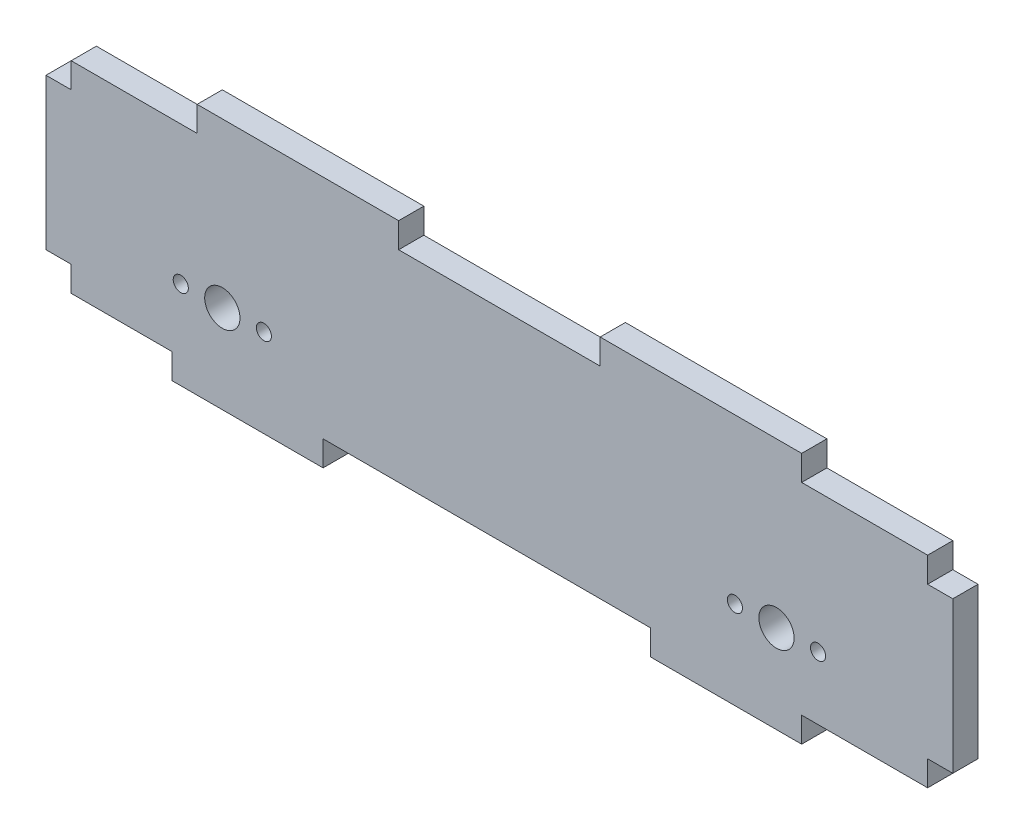
ISO-10303-21;
HEADER;
FILE_DESCRIPTION(('STEP AP214'),'2;1');
FILE_NAME('part.step','',(''),(''),'','','');
FILE_SCHEMA(('AUTOMOTIVE_DESIGN { 1 0 10303 214 1 1 1 1 }'));
ENDSEC;
DATA;
#1=APPLICATION_CONTEXT('core data for automotive mechanical design processes');
#2=APPLICATION_PROTOCOL_DEFINITION('international standard','automotive_design',2000,#1);
#3=PRODUCT_CONTEXT('',#1,'mechanical');
#4=PRODUCT('Part','Part','',(#3));
#5=PRODUCT_RELATED_PRODUCT_CATEGORY('part','',(#4));
#6=PRODUCT_DEFINITION_FORMATION('','',#4);
#7=PRODUCT_DEFINITION_CONTEXT('part definition',#1,'design');
#8=PRODUCT_DEFINITION('design','',#6,#7);
#9=PRODUCT_DEFINITION_SHAPE('','',#8);
#10=(LENGTH_UNIT() NAMED_UNIT(*) SI_UNIT(.MILLI.,.METRE.));
#11=(NAMED_UNIT(*) PLANE_ANGLE_UNIT() SI_UNIT($,.RADIAN.));
#12=(NAMED_UNIT(*) SI_UNIT($,.STERADIAN.) SOLID_ANGLE_UNIT());
#13=UNCERTAINTY_MEASURE_WITH_UNIT(LENGTH_MEASURE(1.E-05),#10,'distance_accuracy_value','');
#14=(GEOMETRIC_REPRESENTATION_CONTEXT(3) GLOBAL_UNCERTAINTY_ASSIGNED_CONTEXT((#13)) GLOBAL_UNIT_ASSIGNED_CONTEXT((#10,
#11,#12)) REPRESENTATION_CONTEXT('',''));
#15=CARTESIAN_POINT('',(0.,0.,0.));
#16=DIRECTION('',(0.,0.,1.));
#17=DIRECTION('',(1.,0.,0.));
#18=AXIS2_PLACEMENT_3D('',#15,#16,#17);
#19=CARTESIAN_POINT('',(0.,-85.8914009426785,5.));
#20=DIRECTION('',(0.,-1.,0.));
#21=DIRECTION('',(0.,0.,-1.));
#22=AXIS2_PLACEMENT_3D('',#19,#20,#21);
#23=PLANE('',#22);
#24=DIRECTION('',(-1.,0.,0.));
#25=VECTOR('',#24,1.);
#26=CARTESIAN_POINT('',(0.,-85.8914009426785,0.));
#27=LINE('',#26,#25);
#28=CARTESIAN_POINT('',(-10.,-85.8914009426785,0.));
#29=VERTEX_POINT('',#28);
#30=CARTESIAN_POINT('',(-30.,-85.8914009426785,0.));
#31=VERTEX_POINT('',#30);
#32=EDGE_CURVE('E268',#29,#31,#27,.T.);
#33=ORIENTED_EDGE('',*,*,#32,.F.);
#34=DIRECTION('',(0.,0.,-1.));
#35=VECTOR('',#34,1.);
#36=CARTESIAN_POINT('',(-10.,-85.8914009426785,5.));
#37=LINE('',#36,#35);
#38=CARTESIAN_POINT('',(-10.,-85.8914009426785,5.));
#39=VERTEX_POINT('',#38);
#40=EDGE_CURVE('E11',#39,#29,#37,.T.);
#41=ORIENTED_EDGE('',*,*,#40,.F.);
#42=DIRECTION('',(-1.,0.,0.));
#43=VECTOR('',#42,1.);
#44=CARTESIAN_POINT('',(0.,-85.8914009426785,5.));
#45=LINE('',#44,#43);
#46=CARTESIAN_POINT('',(-30.,-85.8914009426785,5.));
#47=VERTEX_POINT('',#46);
#48=EDGE_CURVE('E437',#39,#47,#45,.T.);
#49=ORIENTED_EDGE('',*,*,#48,.T.);
#50=DIRECTION('',(0.,0.,-1.));
#51=VECTOR('',#50,1.);
#52=CARTESIAN_POINT('',(-30.,-85.8914009426785,5.));
#53=LINE('',#52,#51);
#54=EDGE_CURVE('E145',#47,#31,#53,.T.);
#55=ORIENTED_EDGE('',*,*,#54,.T.);
#56=EDGE_LOOP('',(#33,#41,#49,#55));
#57=FACE_BOUND('',#56,.T.);
#58=ADVANCED_FACE('F34',(#57),#23,.T.);
#59=CARTESIAN_POINT('',(-10.,0.,5.));
#60=DIRECTION('',(1.,0.,0.));
#61=DIRECTION('',(0.,0.,-1.));
#62=AXIS2_PLACEMENT_3D('',#59,#60,#61);
#63=PLANE('',#62);
#64=DIRECTION('',(0.,-1.,0.));
#65=VECTOR('',#64,1.);
#66=CARTESIAN_POINT('',(-10.,0.,0.));
#67=LINE('',#66,#65);
#68=CARTESIAN_POINT('',(-10.,-90.8914009426783,0.));
#69=VERTEX_POINT('',#68);
#70=EDGE_CURVE('E271',#29,#69,#67,.T.);
#71=ORIENTED_EDGE('',*,*,#70,.T.);
#72=DIRECTION('',(0.,0.,-1.));
#73=VECTOR('',#72,1.);
#74=CARTESIAN_POINT('',(-10.,-90.8914009426783,5.));
#75=LINE('',#74,#73);
#76=CARTESIAN_POINT('',(-10.,-90.8914009426783,5.));
#77=VERTEX_POINT('',#76);
#78=EDGE_CURVE('E43',#77,#69,#75,.T.);
#79=ORIENTED_EDGE('',*,*,#78,.F.);
#80=DIRECTION('',(0.,-1.,0.));
#81=VECTOR('',#80,1.);
#82=CARTESIAN_POINT('',(-10.,0.,5.));
#83=LINE('',#82,#81);
#84=EDGE_CURVE('E433',#39,#77,#83,.T.);
#85=ORIENTED_EDGE('',*,*,#84,.F.);
#86=ORIENTED_EDGE('',*,*,#40,.T.);
#87=EDGE_LOOP('',(#71,#79,#85,#86));
#88=FACE_BOUND('',#87,.T.);
#89=ADVANCED_FACE('F420',(#88),#63,.F.);
#90=CARTESIAN_POINT('',(0.,-90.8914009426783,5.));
#91=DIRECTION('',(0.,-1.,0.));
#92=DIRECTION('',(0.,0.,-1.));
#93=AXIS2_PLACEMENT_3D('',#90,#91,#92);
#94=PLANE('',#93);
#95=DIRECTION('',(-1.,0.,0.));
#96=VECTOR('',#95,1.);
#97=CARTESIAN_POINT('',(0.,-90.8914009426783,0.));
#98=LINE('',#97,#96);
#99=CARTESIAN_POINT('',(20.,-90.8914009426783,0.));
#100=VERTEX_POINT('',#99);
#101=EDGE_CURVE('E274',#100,#69,#98,.T.);
#102=ORIENTED_EDGE('',*,*,#101,.F.);
#103=DIRECTION('',(0.,0.,-1.));
#104=VECTOR('',#103,1.);
#105=CARTESIAN_POINT('',(20.,-90.8914009426783,5.));
#106=LINE('',#105,#104);
#107=CARTESIAN_POINT('',(20.,-90.8914009426783,5.));
#108=VERTEX_POINT('',#107);
#109=EDGE_CURVE('E410',#108,#100,#106,.T.);
#110=ORIENTED_EDGE('',*,*,#109,.F.);
#111=DIRECTION('',(-1.,0.,0.));
#112=VECTOR('',#111,1.);
#113=CARTESIAN_POINT('',(0.,-90.8914009426783,5.));
#114=LINE('',#113,#112);
#115=EDGE_CURVE('E417',#108,#77,#114,.T.);
#116=ORIENTED_EDGE('',*,*,#115,.T.);
#117=ORIENTED_EDGE('',*,*,#78,.T.);
#118=EDGE_LOOP('',(#102,#110,#116,#117));
#119=FACE_BOUND('',#118,.T.);
#120=ADVANCED_FACE('F415',(#119),#94,.T.);
#121=CARTESIAN_POINT('',(20.,0.,5.));
#122=DIRECTION('',(1.,0.,0.));
#123=DIRECTION('',(0.,0.,-1.));
#124=AXIS2_PLACEMENT_3D('',#121,#122,#123);
#125=PLANE('',#124);
#126=DIRECTION('',(0.,-1.,0.));
#127=VECTOR('',#126,1.);
#128=CARTESIAN_POINT('',(20.,0.,0.));
#129=LINE('',#128,#127);
#130=CARTESIAN_POINT('',(20.,-85.8914009426782,0.));
#131=VERTEX_POINT('',#130);
#132=EDGE_CURVE('E277',#131,#100,#129,.T.);
#133=ORIENTED_EDGE('',*,*,#132,.F.);
#134=DIRECTION('',(0.,0.,-1.));
#135=VECTOR('',#134,1.);
#136=CARTESIAN_POINT('',(20.,-85.8914009426782,5.));
#137=LINE('',#136,#135);
#138=CARTESIAN_POINT('',(20.,-85.8914009426782,5.));
#139=VERTEX_POINT('',#138);
#140=EDGE_CURVE('E408',#139,#131,#137,.T.);
#141=ORIENTED_EDGE('',*,*,#140,.F.);
#142=DIRECTION('',(0.,-1.,0.));
#143=VECTOR('',#142,1.);
#144=CARTESIAN_POINT('',(20.,0.,5.));
#145=LINE('',#144,#143);
#146=EDGE_CURVE('E431',#139,#108,#145,.T.);
#147=ORIENTED_EDGE('',*,*,#146,.T.);
#148=ORIENTED_EDGE('',*,*,#109,.T.);
#149=EDGE_LOOP('',(#133,#141,#147,#148));
#150=FACE_BOUND('',#149,.T.);
#151=ADVANCED_FACE('F427',(#150),#125,.T.);
#152=CARTESIAN_POINT('',(0.,-85.8914009426782,5.));
#153=DIRECTION('',(0.,1.,0.));
#154=DIRECTION('',(-1.,0.,0.));
#155=AXIS2_PLACEMENT_3D('',#152,#153,#154);
#156=PLANE('',#155);
#157=DIRECTION('',(1.,0.,0.));
#158=VECTOR('',#157,1.);
#159=CARTESIAN_POINT('',(0.,-85.8914009426782,0.));
#160=LINE('',#159,#158);
#161=CARTESIAN_POINT('',(85.,-85.8914009426782,0.));
#162=VERTEX_POINT('',#161);
#163=EDGE_CURVE('E280',#131,#162,#160,.T.);
#164=ORIENTED_EDGE('',*,*,#163,.T.);
#165=DIRECTION('',(0.,0.,-1.));
#166=VECTOR('',#165,1.);
#167=CARTESIAN_POINT('',(85.,-85.8914009426782,5.));
#168=LINE('',#167,#166);
#169=CARTESIAN_POINT('',(85.,-85.8914009426782,5.));
#170=VERTEX_POINT('',#169);
#171=EDGE_CURVE('E405',#170,#162,#168,.T.);
#172=ORIENTED_EDGE('',*,*,#171,.F.);
#173=DIRECTION('',(1.,0.,0.));
#174=VECTOR('',#173,1.);
#175=CARTESIAN_POINT('',(0.,-85.8914009426782,5.));
#176=LINE('',#175,#174);
#177=EDGE_CURVE('E435',#139,#170,#176,.T.);
#178=ORIENTED_EDGE('',*,*,#177,.F.);
#179=ORIENTED_EDGE('',*,*,#140,.T.);
#180=EDGE_LOOP('',(#164,#172,#178,#179));
#181=FACE_BOUND('',#180,.T.);
#182=ADVANCED_FACE('F784',(#181),#156,.F.);
#183=CARTESIAN_POINT('',(85.,0.,5.));
#184=DIRECTION('',(1.,0.,0.));
#185=DIRECTION('',(0.,0.,-1.));
#186=AXIS2_PLACEMENT_3D('',#183,#184,#185);
#187=PLANE('',#186);
#188=DIRECTION('',(0.,-1.,0.));
#189=VECTOR('',#188,1.);
#190=CARTESIAN_POINT('',(85.,0.,0.));
#191=LINE('',#190,#189);
#192=CARTESIAN_POINT('',(85.,-90.8914009426782,0.));
#193=VERTEX_POINT('',#192);
#194=EDGE_CURVE('E283',#162,#193,#191,.T.);
#195=ORIENTED_EDGE('',*,*,#194,.T.);
#196=DIRECTION('',(0.,0.,-1.));
#197=VECTOR('',#196,1.);
#198=CARTESIAN_POINT('',(85.,-90.8914009426782,5.));
#199=LINE('',#198,#197);
#200=CARTESIAN_POINT('',(85.,-90.8914009426782,5.));
#201=VERTEX_POINT('',#200);
#202=EDGE_CURVE('E403',#201,#193,#199,.T.);
#203=ORIENTED_EDGE('',*,*,#202,.F.);
#204=DIRECTION('',(0.,-1.,0.));
#205=VECTOR('',#204,1.);
#206=CARTESIAN_POINT('',(85.,0.,5.));
#207=LINE('',#206,#205);
#208=EDGE_CURVE('E442',#170,#201,#207,.T.);
#209=ORIENTED_EDGE('',*,*,#208,.F.);
#210=ORIENTED_EDGE('',*,*,#171,.T.);
#211=EDGE_LOOP('',(#195,#203,#209,#210));
#212=FACE_BOUND('',#211,.T.);
#213=ADVANCED_FACE('F806',(#212),#187,.F.);
#214=CARTESIAN_POINT('',(0.,-90.8914009426782,5.));
#215=DIRECTION('',(0.,-1.,0.));
#216=DIRECTION('',(1.,0.,0.));
#217=AXIS2_PLACEMENT_3D('',#214,#215,#216);
#218=PLANE('',#217);
#219=DIRECTION('',(-1.,0.,0.));
#220=VECTOR('',#219,1.);
#221=CARTESIAN_POINT('',(0.,-90.8914009426782,0.));
#222=LINE('',#221,#220);
#223=CARTESIAN_POINT('',(115.,-90.8914009426782,0.));
#224=VERTEX_POINT('',#223);
#225=EDGE_CURVE('E287',#224,#193,#222,.T.);
#226=ORIENTED_EDGE('',*,*,#225,.F.);
#227=DIRECTION('',(0.,0.,-1.));
#228=VECTOR('',#227,1.);
#229=CARTESIAN_POINT('',(115.,-90.8914009426782,5.));
#230=LINE('',#229,#228);
#231=CARTESIAN_POINT('',(115.,-90.8914009426782,5.));
#232=VERTEX_POINT('',#231);
#233=EDGE_CURVE('E401',#232,#224,#230,.T.);
#234=ORIENTED_EDGE('',*,*,#233,.F.);
#235=DIRECTION('',(-1.,0.,0.));
#236=VECTOR('',#235,1.);
#237=CARTESIAN_POINT('',(0.,-90.8914009426782,5.));
#238=LINE('',#237,#236);
#239=EDGE_CURVE('E445',#232,#201,#238,.T.);
#240=ORIENTED_EDGE('',*,*,#239,.T.);
#241=ORIENTED_EDGE('',*,*,#202,.T.);
#242=EDGE_LOOP('',(#226,#234,#240,#241));
#243=FACE_BOUND('',#242,.T.);
#244=ADVANCED_FACE('F795',(#243),#218,.T.);
#245=CARTESIAN_POINT('',(115.,0.,5.));
#246=DIRECTION('',(1.,0.,0.));
#247=DIRECTION('',(0.,0.,-1.));
#248=AXIS2_PLACEMENT_3D('',#245,#246,#247);
#249=PLANE('',#248);
#250=DIRECTION('',(0.,-1.,0.));
#251=VECTOR('',#250,1.);
#252=CARTESIAN_POINT('',(115.,0.,0.));
#253=LINE('',#252,#251);
#254=CARTESIAN_POINT('',(115.,-85.8914009426782,0.));
#255=VERTEX_POINT('',#254);
#256=EDGE_CURVE('E290',#255,#224,#253,.T.);
#257=ORIENTED_EDGE('',*,*,#256,.F.);
#258=DIRECTION('',(0.,0.,-1.));
#259=VECTOR('',#258,1.);
#260=CARTESIAN_POINT('',(115.,-85.8914009426782,5.));
#261=LINE('',#260,#259);
#262=CARTESIAN_POINT('',(115.,-85.8914009426782,5.));
#263=VERTEX_POINT('',#262);
#264=EDGE_CURVE('E399',#263,#255,#261,.T.);
#265=ORIENTED_EDGE('',*,*,#264,.F.);
#266=DIRECTION('',(0.,-1.,0.));
#267=VECTOR('',#266,1.);
#268=CARTESIAN_POINT('',(115.,0.,5.));
#269=LINE('',#268,#267);
#270=EDGE_CURVE('E448',#263,#232,#269,.T.);
#271=ORIENTED_EDGE('',*,*,#270,.T.);
#272=ORIENTED_EDGE('',*,*,#233,.T.);
#273=EDGE_LOOP('',(#257,#265,#271,#272));
#274=FACE_BOUND('',#273,.T.);
#275=ADVANCED_FACE('F781',(#274),#249,.T.);
#276=CARTESIAN_POINT('',(140.,-85.8914009426782,0.));
#277=VERTEX_POINT('',#276);
#278=EDGE_CURVE('E284',#255,#277,#160,.T.);
#279=ORIENTED_EDGE('',*,*,#278,.T.);
#280=DIRECTION('',(0.,0.,-1.));
#281=VECTOR('',#280,1.);
#282=CARTESIAN_POINT('',(140.,-85.8914009426782,5.));
#283=LINE('',#282,#281);
#284=CARTESIAN_POINT('',(140.,-85.8914009426782,5.));
#285=VERTEX_POINT('',#284);
#286=EDGE_CURVE('E397',#285,#277,#283,.T.);
#287=ORIENTED_EDGE('',*,*,#286,.F.);
#288=EDGE_CURVE('E443',#263,#285,#176,.T.);
#289=ORIENTED_EDGE('',*,*,#288,.F.);
#290=ORIENTED_EDGE('',*,*,#264,.T.);
#291=EDGE_LOOP('',(#279,#287,#289,#290));
#292=FACE_BOUND('',#291,.T.);
#293=ADVANCED_FACE('F772',(#292),#156,.F.);
#294=CARTESIAN_POINT('',(140.,0.,5.));
#295=DIRECTION('',(1.,0.,0.));
#296=DIRECTION('',(0.,0.,-1.));
#297=AXIS2_PLACEMENT_3D('',#294,#295,#296);
#298=PLANE('',#297);
#299=DIRECTION('',(0.,-1.,0.));
#300=VECTOR('',#299,1.);
#301=CARTESIAN_POINT('',(140.,0.,0.));
#302=LINE('',#301,#300);
#303=CARTESIAN_POINT('',(140.,-80.8914009426782,0.));
#304=VERTEX_POINT('',#303);
#305=EDGE_CURVE('E293',#304,#277,#302,.T.);
#306=ORIENTED_EDGE('',*,*,#305,.F.);
#307=DIRECTION('',(0.,0.,-1.));
#308=VECTOR('',#307,1.);
#309=CARTESIAN_POINT('',(140.,-80.8914009426782,5.));
#310=LINE('',#309,#308);
#311=CARTESIAN_POINT('',(140.,-80.8914009426782,5.));
#312=VERTEX_POINT('',#311);
#313=EDGE_CURVE('E395',#312,#304,#310,.T.);
#314=ORIENTED_EDGE('',*,*,#313,.F.);
#315=DIRECTION('',(0.,-1.,0.));
#316=VECTOR('',#315,1.);
#317=CARTESIAN_POINT('',(140.,0.,5.));
#318=LINE('',#317,#316);
#319=EDGE_CURVE('E451',#312,#285,#318,.T.);
#320=ORIENTED_EDGE('',*,*,#319,.T.);
#321=ORIENTED_EDGE('',*,*,#286,.T.);
#322=EDGE_LOOP('',(#306,#314,#320,#321));
#323=FACE_BOUND('',#322,.T.);
#324=ADVANCED_FACE('F763',(#323),#298,.T.);
#325=CARTESIAN_POINT('',(0.,-80.8914009426782,5.));
#326=DIRECTION('',(0.,1.,0.));
#327=DIRECTION('',(0.,0.,1.));
#328=AXIS2_PLACEMENT_3D('',#325,#326,#327);
#329=PLANE('',#328);
#330=DIRECTION('',(1.,0.,0.));
#331=VECTOR('',#330,1.);
#332=CARTESIAN_POINT('',(0.,-80.8914009426782,0.));
#333=LINE('',#332,#331);
#334=CARTESIAN_POINT('',(145.,-80.8914009426782,0.));
#335=VERTEX_POINT('',#334);
#336=EDGE_CURVE('E296',#304,#335,#333,.T.);
#337=ORIENTED_EDGE('',*,*,#336,.T.);
#338=DIRECTION('',(0.,0.,-1.));
#339=VECTOR('',#338,1.);
#340=CARTESIAN_POINT('',(145.,-80.8914009426782,5.));
#341=LINE('',#340,#339);
#342=CARTESIAN_POINT('',(145.,-80.8914009426782,5.));
#343=VERTEX_POINT('',#342);
#344=EDGE_CURVE('E392',#343,#335,#341,.T.);
#345=ORIENTED_EDGE('',*,*,#344,.F.);
#346=DIRECTION('',(1.,0.,0.));
#347=VECTOR('',#346,1.);
#348=CARTESIAN_POINT('',(0.,-80.8914009426782,5.));
#349=LINE('',#348,#347);
#350=EDGE_CURVE('E454',#312,#343,#349,.T.);
#351=ORIENTED_EDGE('',*,*,#350,.F.);
#352=ORIENTED_EDGE('',*,*,#313,.T.);
#353=EDGE_LOOP('',(#337,#345,#351,#352));
#354=FACE_BOUND('',#353,.T.);
#355=ADVANCED_FACE('F754',(#354),#329,.F.);
#356=CARTESIAN_POINT('',(145.,0.,5.));
#357=DIRECTION('',(-1.,0.,0.));
#358=DIRECTION('',(0.,0.,1.));
#359=AXIS2_PLACEMENT_3D('',#356,#357,#358);
#360=PLANE('',#359);
#361=DIRECTION('',(0.,1.,0.));
#362=VECTOR('',#361,1.);
#363=CARTESIAN_POINT('',(145.,0.,0.));
#364=LINE('',#363,#362);
#365=CARTESIAN_POINT('',(145.,-50.8914009426782,0.));
#366=VERTEX_POINT('',#365);
#367=EDGE_CURVE('E299',#335,#366,#364,.T.);
#368=ORIENTED_EDGE('',*,*,#367,.T.);
#369=DIRECTION('',(0.,0.,-1.));
#370=VECTOR('',#369,1.);
#371=CARTESIAN_POINT('',(145.,-50.8914009426782,5.));
#372=LINE('',#371,#370);
#373=CARTESIAN_POINT('',(145.,-50.8914009426782,5.));
#374=VERTEX_POINT('',#373);
#375=EDGE_CURVE('E390',#374,#366,#372,.T.);
#376=ORIENTED_EDGE('',*,*,#375,.F.);
#377=DIRECTION('',(0.,1.,0.));
#378=VECTOR('',#377,1.);
#379=CARTESIAN_POINT('',(145.,0.,5.));
#380=LINE('',#379,#378);
#381=EDGE_CURVE('E457',#343,#374,#380,.T.);
#382=ORIENTED_EDGE('',*,*,#381,.F.);
#383=ORIENTED_EDGE('',*,*,#344,.T.);
#384=EDGE_LOOP('',(#368,#376,#382,#383));
#385=FACE_BOUND('',#384,.T.);
#386=ADVANCED_FACE('F745',(#385),#360,.F.);
#387=CARTESIAN_POINT('',(0.,-50.8914009426782,5.));
#388=DIRECTION('',(0.,1.,0.));
#389=DIRECTION('',(0.,0.,1.));
#390=AXIS2_PLACEMENT_3D('',#387,#388,#389);
#391=PLANE('',#390);
#392=DIRECTION('',(1.,0.,0.));
#393=VECTOR('',#392,1.);
#394=CARTESIAN_POINT('',(0.,-50.8914009426782,0.));
#395=LINE('',#394,#393);
#396=CARTESIAN_POINT('',(140.,-50.8914009426782,0.));
#397=VERTEX_POINT('',#396);
#398=EDGE_CURVE('E302',#397,#366,#395,.T.);
#399=ORIENTED_EDGE('',*,*,#398,.F.);
#400=DIRECTION('',(0.,0.,-1.));
#401=VECTOR('',#400,1.);
#402=CARTESIAN_POINT('',(140.,-50.8914009426782,5.));
#403=LINE('',#402,#401);
#404=CARTESIAN_POINT('',(140.,-50.8914009426782,5.));
#405=VERTEX_POINT('',#404);
#406=EDGE_CURVE('E388',#405,#397,#403,.T.);
#407=ORIENTED_EDGE('',*,*,#406,.F.);
#408=DIRECTION('',(1.,0.,0.));
#409=VECTOR('',#408,1.);
#410=CARTESIAN_POINT('',(0.,-50.8914009426782,5.));
#411=LINE('',#410,#409);
#412=EDGE_CURVE('E459',#405,#374,#411,.T.);
#413=ORIENTED_EDGE('',*,*,#412,.T.);
#414=ORIENTED_EDGE('',*,*,#375,.T.);
#415=EDGE_LOOP('',(#399,#407,#413,#414));
#416=FACE_BOUND('',#415,.T.);
#417=ADVANCED_FACE('F736',(#416),#391,.T.);
#418=CARTESIAN_POINT('',(140.,7.77156117237608E-13,5.));
#419=DIRECTION('',(1.,0.,0.));
#420=DIRECTION('',(0.,1.,0.));
#421=AXIS2_PLACEMENT_3D('',#418,#419,#420);
#422=PLANE('',#421);
#423=DIRECTION('',(0.,-1.,0.));
#424=VECTOR('',#423,1.);
#425=CARTESIAN_POINT('',(140.,7.77156117237608E-13,0.));
#426=LINE('',#425,#424);
#427=CARTESIAN_POINT('',(140.,-45.8914009426782,0.));
#428=VERTEX_POINT('',#427);
#429=EDGE_CURVE('E305',#428,#397,#426,.T.);
#430=ORIENTED_EDGE('',*,*,#429,.F.);
#431=DIRECTION('',(0.,0.,-1.));
#432=VECTOR('',#431,1.);
#433=CARTESIAN_POINT('',(140.,-45.8914009426782,5.));
#434=LINE('',#433,#432);
#435=CARTESIAN_POINT('',(140.,-45.8914009426782,5.));
#436=VERTEX_POINT('',#435);
#437=EDGE_CURVE('E386',#436,#428,#434,.T.);
#438=ORIENTED_EDGE('',*,*,#437,.F.);
#439=DIRECTION('',(0.,-1.,0.));
#440=VECTOR('',#439,1.);
#441=CARTESIAN_POINT('',(140.,7.77156117237608E-13,5.));
#442=LINE('',#441,#440);
#443=EDGE_CURVE('E462',#436,#405,#442,.T.);
#444=ORIENTED_EDGE('',*,*,#443,.T.);
#445=ORIENTED_EDGE('',*,*,#406,.T.);
#446=EDGE_LOOP('',(#430,#438,#444,#445));
#447=FACE_BOUND('',#446,.T.);
#448=ADVANCED_FACE('F727',(#447),#422,.T.);
#449=CARTESIAN_POINT('',(0.,-45.8914009426782,5.));
#450=DIRECTION('',(0.,-1.,0.));
#451=DIRECTION('',(0.,0.,-1.));
#452=AXIS2_PLACEMENT_3D('',#449,#450,#451);
#453=PLANE('',#452);
#454=DIRECTION('',(-1.,0.,0.));
#455=VECTOR('',#454,1.);
#456=CARTESIAN_POINT('',(0.,-45.8914009426782,0.));
#457=LINE('',#456,#455);
#458=CARTESIAN_POINT('',(115.,-45.8914009426782,0.));
#459=VERTEX_POINT('',#458);
#460=EDGE_CURVE('E308',#428,#459,#457,.T.);
#461=ORIENTED_EDGE('',*,*,#460,.T.);
#462=DIRECTION('',(0.,0.,-1.));
#463=VECTOR('',#462,1.);
#464=CARTESIAN_POINT('',(115.,-45.8914009426782,5.));
#465=LINE('',#464,#463);
#466=CARTESIAN_POINT('',(115.,-45.8914009426782,5.));
#467=VERTEX_POINT('',#466);
#468=EDGE_CURVE('E383',#467,#459,#465,.T.);
#469=ORIENTED_EDGE('',*,*,#468,.F.);
#470=DIRECTION('',(-1.,0.,0.));
#471=VECTOR('',#470,1.);
#472=CARTESIAN_POINT('',(0.,-45.8914009426782,5.));
#473=LINE('',#472,#471);
#474=EDGE_CURVE('E465',#436,#467,#473,.T.);
#475=ORIENTED_EDGE('',*,*,#474,.F.);
#476=ORIENTED_EDGE('',*,*,#437,.T.);
#477=EDGE_LOOP('',(#461,#469,#475,#476));
#478=FACE_BOUND('',#477,.T.);
#479=ADVANCED_FACE('F718',(#478),#453,.F.);
#480=CARTESIAN_POINT('',(115.,0.,5.));
#481=DIRECTION('',(-1.,0.,0.));
#482=DIRECTION('',(0.,0.,1.));
#483=AXIS2_PLACEMENT_3D('',#480,#481,#482);
#484=PLANE('',#483);
#485=DIRECTION('',(0.,1.,0.));
#486=VECTOR('',#485,1.);
#487=CARTESIAN_POINT('',(115.,0.,0.));
#488=LINE('',#487,#486);
#489=CARTESIAN_POINT('',(115.,-40.8914009426782,0.));
#490=VERTEX_POINT('',#489);
#491=EDGE_CURVE('E311',#459,#490,#488,.T.);
#492=ORIENTED_EDGE('',*,*,#491,.T.);
#493=DIRECTION('',(0.,0.,-1.));
#494=VECTOR('',#493,1.);
#495=CARTESIAN_POINT('',(115.,-40.8914009426782,5.));
#496=LINE('',#495,#494);
#497=CARTESIAN_POINT('',(115.,-40.8914009426782,5.));
#498=VERTEX_POINT('',#497);
#499=EDGE_CURVE('E380',#498,#490,#496,.T.);
#500=ORIENTED_EDGE('',*,*,#499,.F.);
#501=DIRECTION('',(0.,1.,0.));
#502=VECTOR('',#501,1.);
#503=CARTESIAN_POINT('',(115.,0.,5.));
#504=LINE('',#503,#502);
#505=EDGE_CURVE('E468',#467,#498,#504,.T.);
#506=ORIENTED_EDGE('',*,*,#505,.F.);
#507=ORIENTED_EDGE('',*,*,#468,.T.);
#508=EDGE_LOOP('',(#492,#500,#506,#507));
#509=FACE_BOUND('',#508,.T.);
#510=ADVANCED_FACE('F709',(#509),#484,.F.);
#511=CARTESIAN_POINT('',(0.,-40.8914009426782,5.));
#512=DIRECTION('',(0.,-1.,0.));
#513=DIRECTION('',(1.,0.,0.));
#514=AXIS2_PLACEMENT_3D('',#511,#512,#513);
#515=PLANE('',#514);
#516=DIRECTION('',(-1.,0.,0.));
#517=VECTOR('',#516,1.);
#518=CARTESIAN_POINT('',(0.,-40.8914009426782,0.));
#519=LINE('',#518,#517);
#520=CARTESIAN_POINT('',(75.,-40.8914009426782,0.));
#521=VERTEX_POINT('',#520);
#522=EDGE_CURVE('E314',#490,#521,#519,.T.);
#523=ORIENTED_EDGE('',*,*,#522,.T.);
#524=DIRECTION('',(0.,0.,-1.));
#525=VECTOR('',#524,1.);
#526=CARTESIAN_POINT('',(75.,-40.8914009426782,5.));
#527=LINE('',#526,#525);
#528=CARTESIAN_POINT('',(75.,-40.8914009426782,5.));
#529=VERTEX_POINT('',#528);
#530=EDGE_CURVE('E378',#529,#521,#527,.T.);
#531=ORIENTED_EDGE('',*,*,#530,.F.);
#532=DIRECTION('',(-1.,0.,0.));
#533=VECTOR('',#532,1.);
#534=CARTESIAN_POINT('',(0.,-40.8914009426782,5.));
#535=LINE('',#534,#533);
#536=EDGE_CURVE('E471',#498,#529,#535,.T.);
#537=ORIENTED_EDGE('',*,*,#536,.F.);
#538=ORIENTED_EDGE('',*,*,#499,.T.);
#539=EDGE_LOOP('',(#523,#531,#537,#538));
#540=FACE_BOUND('',#539,.T.);
#541=ADVANCED_FACE('F700',(#540),#515,.F.);
#542=CARTESIAN_POINT('',(75.,0.,5.));
#543=DIRECTION('',(-1.,0.,0.));
#544=DIRECTION('',(0.,0.,1.));
#545=AXIS2_PLACEMENT_3D('',#542,#543,#544);
#546=PLANE('',#545);
#547=DIRECTION('',(0.,1.,0.));
#548=VECTOR('',#547,1.);
#549=CARTESIAN_POINT('',(75.,0.,0.));
#550=LINE('',#549,#548);
#551=CARTESIAN_POINT('',(75.,-45.8914009426786,0.));
#552=VERTEX_POINT('',#551);
#553=EDGE_CURVE('E317',#552,#521,#550,.T.);
#554=ORIENTED_EDGE('',*,*,#553,.F.);
#555=DIRECTION('',(0.,0.,-1.));
#556=VECTOR('',#555,1.);
#557=CARTESIAN_POINT('',(75.,-45.8914009426786,5.));
#558=LINE('',#557,#556);
#559=CARTESIAN_POINT('',(75.,-45.8914009426786,5.));
#560=VERTEX_POINT('',#559);
#561=EDGE_CURVE('E376',#560,#552,#558,.T.);
#562=ORIENTED_EDGE('',*,*,#561,.F.);
#563=DIRECTION('',(0.,1.,0.));
#564=VECTOR('',#563,1.);
#565=CARTESIAN_POINT('',(75.,0.,5.));
#566=LINE('',#565,#564);
#567=EDGE_CURVE('E473',#560,#529,#566,.T.);
#568=ORIENTED_EDGE('',*,*,#567,.T.);
#569=ORIENTED_EDGE('',*,*,#530,.T.);
#570=EDGE_LOOP('',(#554,#562,#568,#569));
#571=FACE_BOUND('',#570,.T.);
#572=ADVANCED_FACE('F691',(#571),#546,.T.);
#573=CARTESIAN_POINT('',(0.,-45.8914009426786,5.));
#574=DIRECTION('',(0.,-1.,0.));
#575=DIRECTION('',(1.,0.,0.));
#576=AXIS2_PLACEMENT_3D('',#573,#574,#575);
#577=PLANE('',#576);
#578=DIRECTION('',(-1.,0.,0.));
#579=VECTOR('',#578,1.);
#580=CARTESIAN_POINT('',(0.,-45.8914009426786,0.));
#581=LINE('',#580,#579);
#582=CARTESIAN_POINT('',(35.,-45.8914009426786,0.));
#583=VERTEX_POINT('',#582);
#584=EDGE_CURVE('E320',#552,#583,#581,.T.);
#585=ORIENTED_EDGE('',*,*,#584,.T.);
#586=DIRECTION('',(0.,0.,-1.));
#587=VECTOR('',#586,1.);
#588=CARTESIAN_POINT('',(35.,-45.8914009426786,5.));
#589=LINE('',#588,#587);
#590=CARTESIAN_POINT('',(35.,-45.8914009426786,5.));
#591=VERTEX_POINT('',#590);
#592=EDGE_CURVE('E373',#591,#583,#589,.T.);
#593=ORIENTED_EDGE('',*,*,#592,.F.);
#594=DIRECTION('',(-1.,0.,0.));
#595=VECTOR('',#594,1.);
#596=CARTESIAN_POINT('',(0.,-45.8914009426786,5.));
#597=LINE('',#596,#595);
#598=EDGE_CURVE('E476',#560,#591,#597,.T.);
#599=ORIENTED_EDGE('',*,*,#598,.F.);
#600=ORIENTED_EDGE('',*,*,#561,.T.);
#601=EDGE_LOOP('',(#585,#593,#599,#600));
#602=FACE_BOUND('',#601,.T.);
#603=ADVANCED_FACE('F682',(#602),#577,.F.);
#604=CARTESIAN_POINT('',(35.,0.,5.));
#605=DIRECTION('',(-1.,0.,0.));
#606=DIRECTION('',(0.,0.,1.));
#607=AXIS2_PLACEMENT_3D('',#604,#605,#606);
#608=PLANE('',#607);
#609=DIRECTION('',(0.,1.,0.));
#610=VECTOR('',#609,1.);
#611=CARTESIAN_POINT('',(35.,0.,0.));
#612=LINE('',#611,#610);
#613=CARTESIAN_POINT('',(35.,-40.8914009426786,0.));
#614=VERTEX_POINT('',#613);
#615=EDGE_CURVE('E323',#583,#614,#612,.T.);
#616=ORIENTED_EDGE('',*,*,#615,.T.);
#617=DIRECTION('',(0.,0.,-1.));
#618=VECTOR('',#617,1.);
#619=CARTESIAN_POINT('',(35.,-40.8914009426786,5.));
#620=LINE('',#619,#618);
#621=CARTESIAN_POINT('',(35.,-40.8914009426786,5.));
#622=VERTEX_POINT('',#621);
#623=EDGE_CURVE('E370',#622,#614,#620,.T.);
#624=ORIENTED_EDGE('',*,*,#623,.F.);
#625=DIRECTION('',(0.,1.,0.));
#626=VECTOR('',#625,1.);
#627=CARTESIAN_POINT('',(35.,0.,5.));
#628=LINE('',#627,#626);
#629=EDGE_CURVE('E479',#591,#622,#628,.T.);
#630=ORIENTED_EDGE('',*,*,#629,.F.);
#631=ORIENTED_EDGE('',*,*,#592,.T.);
#632=EDGE_LOOP('',(#616,#624,#630,#631));
#633=FACE_BOUND('',#632,.T.);
#634=ADVANCED_FACE('F673',(#633),#608,.F.);
#635=CARTESIAN_POINT('',(2.8374109272338E-13,-40.8914009426788,5.));
#636=DIRECTION('',(0.,-1.,0.));
#637=DIRECTION('',(1.,0.,0.));
#638=AXIS2_PLACEMENT_3D('',#635,#636,#637);
#639=PLANE('',#638);
#640=DIRECTION('',(-1.,0.,0.));
#641=VECTOR('',#640,1.);
#642=CARTESIAN_POINT('',(2.8374109272338E-13,-40.8914009426788,0.));
#643=LINE('',#642,#641);
#644=CARTESIAN_POINT('',(-5.00000000000001,-40.8914009426789,0.));
#645=VERTEX_POINT('',#644);
#646=EDGE_CURVE('E326',#614,#645,#643,.T.);
#647=ORIENTED_EDGE('',*,*,#646,.T.);
#648=DIRECTION('',(0.,0.,-1.));
#649=VECTOR('',#648,1.);
#650=CARTESIAN_POINT('',(-5.00000000000001,-40.8914009426789,5.));
#651=LINE('',#650,#649);
#652=CARTESIAN_POINT('',(-5.00000000000001,-40.8914009426789,5.));
#653=VERTEX_POINT('',#652);
#654=EDGE_CURVE('E368',#653,#645,#651,.T.);
#655=ORIENTED_EDGE('',*,*,#654,.F.);
#656=DIRECTION('',(-1.,0.,0.));
#657=VECTOR('',#656,1.);
#658=CARTESIAN_POINT('',(2.8374109272338E-13,-40.8914009426788,5.));
#659=LINE('',#658,#657);
#660=EDGE_CURVE('E482',#622,#653,#659,.T.);
#661=ORIENTED_EDGE('',*,*,#660,.F.);
#662=ORIENTED_EDGE('',*,*,#623,.T.);
#663=EDGE_LOOP('',(#647,#655,#661,#662));
#664=FACE_BOUND('',#663,.T.);
#665=ADVANCED_FACE('F664',(#664),#639,.F.);
#666=CARTESIAN_POINT('',(-5.00000000000001,0.,5.));
#667=DIRECTION('',(-1.,0.,0.));
#668=DIRECTION('',(0.,0.,1.));
#669=AXIS2_PLACEMENT_3D('',#666,#667,#668);
#670=PLANE('',#669);
#671=DIRECTION('',(0.,1.,0.));
#672=VECTOR('',#671,1.);
#673=CARTESIAN_POINT('',(-5.00000000000001,0.,0.));
#674=LINE('',#673,#672);
#675=CARTESIAN_POINT('',(-5.00000000000001,-45.8914009426789,0.));
#676=VERTEX_POINT('',#675);
#677=EDGE_CURVE('E329',#676,#645,#674,.T.);
#678=ORIENTED_EDGE('',*,*,#677,.F.);
#679=DIRECTION('',(0.,0.,-1.));
#680=VECTOR('',#679,1.);
#681=CARTESIAN_POINT('',(-5.00000000000001,-45.8914009426789,5.));
#682=LINE('',#681,#680);
#683=CARTESIAN_POINT('',(-5.00000000000001,-45.8914009426789,5.));
#684=VERTEX_POINT('',#683);
#685=EDGE_CURVE('E366',#684,#676,#682,.T.);
#686=ORIENTED_EDGE('',*,*,#685,.F.);
#687=DIRECTION('',(0.,1.,0.));
#688=VECTOR('',#687,1.);
#689=CARTESIAN_POINT('',(-5.00000000000001,0.,5.));
#690=LINE('',#689,#688);
#691=EDGE_CURVE('E484',#684,#653,#690,.T.);
#692=ORIENTED_EDGE('',*,*,#691,.T.);
#693=ORIENTED_EDGE('',*,*,#654,.T.);
#694=EDGE_LOOP('',(#678,#686,#692,#693));
#695=FACE_BOUND('',#694,.T.);
#696=ADVANCED_FACE('F656',(#695),#670,.T.);
#697=CARTESIAN_POINT('',(0.,-45.8914009426789,5.));
#698=DIRECTION('',(0.,1.,0.));
#699=DIRECTION('',(-1.,0.,0.));
#700=AXIS2_PLACEMENT_3D('',#697,#698,#699);
#701=PLANE('',#700);
#702=DIRECTION('',(1.,0.,0.));
#703=VECTOR('',#702,1.);
#704=CARTESIAN_POINT('',(0.,-45.8914009426789,0.));
#705=LINE('',#704,#703);
#706=CARTESIAN_POINT('',(-30.,-45.8914009426789,0.));
#707=VERTEX_POINT('',#706);
#708=EDGE_CURVE('E332',#707,#676,#705,.T.);
#709=ORIENTED_EDGE('',*,*,#708,.F.);
#710=DIRECTION('',(0.,0.,-1.));
#711=VECTOR('',#710,1.);
#712=CARTESIAN_POINT('',(-30.,-45.8914009426789,5.));
#713=LINE('',#712,#711);
#714=CARTESIAN_POINT('',(-30.,-45.8914009426789,5.));
#715=VERTEX_POINT('',#714);
#716=EDGE_CURVE('E364',#715,#707,#713,.T.);
#717=ORIENTED_EDGE('',*,*,#716,.F.);
#718=DIRECTION('',(1.,0.,0.));
#719=VECTOR('',#718,1.);
#720=CARTESIAN_POINT('',(0.,-45.8914009426789,5.));
#721=LINE('',#720,#719);
#722=EDGE_CURVE('E487',#715,#684,#721,.T.);
#723=ORIENTED_EDGE('',*,*,#722,.T.);
#724=ORIENTED_EDGE('',*,*,#685,.T.);
#725=EDGE_LOOP('',(#709,#717,#723,#724));
#726=FACE_BOUND('',#725,.T.);
#727=ADVANCED_FACE('F499',(#726),#701,.T.);
#728=CARTESIAN_POINT('',(-30.,0.,5.));
#729=DIRECTION('',(-1.,0.,0.));
#730=DIRECTION('',(0.,0.,1.));
#731=AXIS2_PLACEMENT_3D('',#728,#729,#730);
#732=PLANE('',#731);
#733=DIRECTION('',(0.,1.,0.));
#734=VECTOR('',#733,1.);
#735=CARTESIAN_POINT('',(-30.,0.,0.));
#736=LINE('',#735,#734);
#737=CARTESIAN_POINT('',(-30.,-50.8914009426787,0.));
#738=VERTEX_POINT('',#737);
#739=EDGE_CURVE('E335',#738,#707,#736,.T.);
#740=ORIENTED_EDGE('',*,*,#739,.F.);
#741=DIRECTION('',(0.,0.,-1.));
#742=VECTOR('',#741,1.);
#743=CARTESIAN_POINT('',(-30.,-50.8914009426787,5.));
#744=LINE('',#743,#742);
#745=CARTESIAN_POINT('',(-30.,-50.8914009426787,5.));
#746=VERTEX_POINT('',#745);
#747=EDGE_CURVE('E362',#746,#738,#744,.T.);
#748=ORIENTED_EDGE('',*,*,#747,.F.);
#749=DIRECTION('',(0.,1.,0.));
#750=VECTOR('',#749,1.);
#751=CARTESIAN_POINT('',(-30.,0.,5.));
#752=LINE('',#751,#750);
#753=EDGE_CURVE('E490',#746,#715,#752,.T.);
#754=ORIENTED_EDGE('',*,*,#753,.T.);
#755=ORIENTED_EDGE('',*,*,#716,.T.);
#756=EDGE_LOOP('',(#740,#748,#754,#755));
#757=FACE_BOUND('',#756,.T.);
#758=ADVANCED_FACE('F494',(#757),#732,.T.);
#759=CARTESIAN_POINT('',(0.,-50.8914009426787,5.));
#760=DIRECTION('',(0.,-1.,0.));
#761=DIRECTION('',(0.,0.,-1.));
#762=AXIS2_PLACEMENT_3D('',#759,#760,#761);
#763=PLANE('',#762);
#764=DIRECTION('',(-1.,0.,0.));
#765=VECTOR('',#764,1.);
#766=CARTESIAN_POINT('',(0.,-50.8914009426787,0.));
#767=LINE('',#766,#765);
#768=CARTESIAN_POINT('',(-35.,-50.8914009426787,0.));
#769=VERTEX_POINT('',#768);
#770=EDGE_CURVE('E338',#738,#769,#767,.T.);
#771=ORIENTED_EDGE('',*,*,#770,.T.);
#772=DIRECTION('',(0.,0.,-1.));
#773=VECTOR('',#772,1.);
#774=CARTESIAN_POINT('',(-35.,-50.8914009426787,5.));
#775=LINE('',#774,#773);
#776=CARTESIAN_POINT('',(-35.,-50.8914009426787,5.));
#777=VERTEX_POINT('',#776);
#778=EDGE_CURVE('E235',#777,#769,#775,.T.);
#779=ORIENTED_EDGE('',*,*,#778,.F.);
#780=DIRECTION('',(-1.,0.,0.));
#781=VECTOR('',#780,1.);
#782=CARTESIAN_POINT('',(0.,-50.8914009426787,5.));
#783=LINE('',#782,#781);
#784=EDGE_CURVE('E242',#746,#777,#783,.T.);
#785=ORIENTED_EDGE('',*,*,#784,.F.);
#786=ORIENTED_EDGE('',*,*,#747,.T.);
#787=EDGE_LOOP('',(#771,#779,#785,#786));
#788=FACE_BOUND('',#787,.T.);
#789=ADVANCED_FACE('F503',(#788),#763,.F.);
#790=CARTESIAN_POINT('',(-35.,0.,5.));
#791=DIRECTION('',(-1.,0.,0.));
#792=DIRECTION('',(0.,-1.,0.));
#793=AXIS2_PLACEMENT_3D('',#790,#791,#792);
#794=PLANE('',#793);
#795=DIRECTION('',(0.,1.,0.));
#796=VECTOR('',#795,1.);
#797=CARTESIAN_POINT('',(-35.,0.,0.));
#798=LINE('',#797,#796);
#799=CARTESIAN_POINT('',(-35.,-80.8914009426785,0.));
#800=VERTEX_POINT('',#799);
#801=EDGE_CURVE('E230',#800,#769,#798,.T.);
#802=ORIENTED_EDGE('',*,*,#801,.F.);
#803=DIRECTION('',(0.,0.,-1.));
#804=VECTOR('',#803,1.);
#805=CARTESIAN_POINT('',(-35.,-80.8914009426785,5.));
#806=LINE('',#805,#804);
#807=CARTESIAN_POINT('',(-35.,-80.8914009426785,5.));
#808=VERTEX_POINT('',#807);
#809=EDGE_CURVE('E225',#808,#800,#806,.T.);
#810=ORIENTED_EDGE('',*,*,#809,.F.);
#811=DIRECTION('',(0.,1.,0.));
#812=VECTOR('',#811,1.);
#813=CARTESIAN_POINT('',(-35.,0.,5.));
#814=LINE('',#813,#812);
#815=EDGE_CURVE('E228',#808,#777,#814,.T.);
#816=ORIENTED_EDGE('',*,*,#815,.T.);
#817=ORIENTED_EDGE('',*,*,#778,.T.);
#818=EDGE_LOOP('',(#802,#810,#816,#817));
#819=FACE_BOUND('',#818,.T.);
#820=ADVANCED_FACE('F227',(#819),#794,.T.);
#821=CARTESIAN_POINT('',(0.,-80.8914009426785,5.));
#822=DIRECTION('',(0.,-1.,0.));
#823=DIRECTION('',(0.,0.,-1.));
#824=AXIS2_PLACEMENT_3D('',#821,#822,#823);
#825=PLANE('',#824);
#826=DIRECTION('',(-1.,0.,0.));
#827=VECTOR('',#826,1.);
#828=CARTESIAN_POINT('',(0.,-80.8914009426785,0.));
#829=LINE('',#828,#827);
#830=CARTESIAN_POINT('',(-30.,-80.8914009426785,0.));
#831=VERTEX_POINT('',#830);
#832=EDGE_CURVE('E342',#831,#800,#829,.T.);
#833=ORIENTED_EDGE('',*,*,#832,.F.);
#834=DIRECTION('',(0.,0.,-1.));
#835=VECTOR('',#834,1.);
#836=CARTESIAN_POINT('',(-30.,-80.8914009426785,5.));
#837=LINE('',#836,#835);
#838=CARTESIAN_POINT('',(-30.,-80.8914009426785,5.));
#839=VERTEX_POINT('',#838);
#840=EDGE_CURVE('E138',#839,#831,#837,.T.);
#841=ORIENTED_EDGE('',*,*,#840,.F.);
#842=DIRECTION('',(-1.,0.,0.));
#843=VECTOR('',#842,1.);
#844=CARTESIAN_POINT('',(0.,-80.8914009426785,5.));
#845=LINE('',#844,#843);
#846=EDGE_CURVE('E239',#839,#808,#845,.T.);
#847=ORIENTED_EDGE('',*,*,#846,.T.);
#848=ORIENTED_EDGE('',*,*,#809,.T.);
#849=EDGE_LOOP('',(#833,#841,#847,#848));
#850=FACE_BOUND('',#849,.T.);
#851=ADVANCED_FACE('F245',(#850),#825,.T.);
#852=CARTESIAN_POINT('',(118.25,-73.3914009426782,5.));
#853=DIRECTION('',(0.,0.,-1.));
#854=DIRECTION('',(-1.,0.,0.));
#855=AXIS2_PLACEMENT_3D('',#852,#853,#854);
#856=CYLINDRICAL_SURFACE('',#855,1.5);
#857=CARTESIAN_POINT('',(118.25,-73.3914009426782,5.));
#858=DIRECTION('',(0.,0.,1.));
#859=DIRECTION('',(1.,0.,0.));
#860=AXIS2_PLACEMENT_3D('',#857,#858,#859);
#861=CIRCLE('',#860,1.5);
#862=CARTESIAN_POINT('',(119.75,-73.3914009426782,5.));
#863=VERTEX_POINT('',#862);
#864=EDGE_CURVE('E256',#863,#863,#861,.T.);
#865=ORIENTED_EDGE('',*,*,#864,.T.);
#866=EDGE_LOOP('',(#865));
#867=FACE_BOUND('',#866,.T.);
#868=CARTESIAN_POINT('',(118.25,-73.3914009426782,0.));
#869=DIRECTION('',(0.,0.,1.));
#870=DIRECTION('',(1.,0.,0.));
#871=AXIS2_PLACEMENT_3D('',#868,#869,#870);
#872=CIRCLE('',#871,1.5);
#873=CARTESIAN_POINT('',(119.75,-73.3914009426782,0.));
#874=VERTEX_POINT('',#873);
#875=EDGE_CURVE('E352',#874,#874,#872,.T.);
#876=ORIENTED_EDGE('',*,*,#875,.F.);
#877=EDGE_LOOP('',(#876));
#878=FACE_BOUND('',#877,.T.);
#879=ADVANCED_FACE('F549',(#867,#878),#856,.F.);
#880=CARTESIAN_POINT('',(101.75,-73.3914009426782,5.));
#881=DIRECTION('',(0.,0.,-1.));
#882=DIRECTION('',(-1.,0.,0.));
#883=AXIS2_PLACEMENT_3D('',#880,#881,#882);
#884=CYLINDRICAL_SURFACE('',#883,1.5);
#885=CARTESIAN_POINT('',(101.75,-73.3914009426782,5.));
#886=DIRECTION('',(0.,0.,1.));
#887=DIRECTION('',(1.,0.,0.));
#888=AXIS2_PLACEMENT_3D('',#885,#886,#887);
#889=CIRCLE('',#888,1.5);
#890=CARTESIAN_POINT('',(103.25,-73.3914009426782,5.));
#891=VERTEX_POINT('',#890);
#892=EDGE_CURVE('E253',#891,#891,#889,.T.);
#893=ORIENTED_EDGE('',*,*,#892,.T.);
#894=EDGE_LOOP('',(#893));
#895=FACE_BOUND('',#894,.T.);
#896=CARTESIAN_POINT('',(101.75,-73.3914009426782,0.));
#897=DIRECTION('',(0.,0.,1.));
#898=DIRECTION('',(1.,0.,0.));
#899=AXIS2_PLACEMENT_3D('',#896,#897,#898);
#900=CIRCLE('',#899,1.5);
#901=CARTESIAN_POINT('',(103.25,-73.3914009426782,0.));
#902=VERTEX_POINT('',#901);
#903=EDGE_CURVE('E349',#902,#902,#900,.T.);
#904=ORIENTED_EDGE('',*,*,#903,.F.);
#905=EDGE_LOOP('',(#904));
#906=FACE_BOUND('',#905,.T.);
#907=ADVANCED_FACE('F552',(#895,#906),#884,.F.);
#908=CARTESIAN_POINT('',(110.,-73.3914009426782,5.));
#909=DIRECTION('',(0.,0.,-1.));
#910=DIRECTION('',(-1.,0.,0.));
#911=AXIS2_PLACEMENT_3D('',#908,#909,#910);
#912=CYLINDRICAL_SURFACE('',#911,3.50000000000001);
#913=CARTESIAN_POINT('',(110.,-73.3914009426782,5.));
#914=DIRECTION('',(0.,0.,1.));
#915=DIRECTION('',(1.,0.,0.));
#916=AXIS2_PLACEMENT_3D('',#913,#914,#915);
#917=CIRCLE('',#916,3.50000000000001);
#918=CARTESIAN_POINT('',(113.5,-73.3914009426782,5.));
#919=VERTEX_POINT('',#918);
#920=EDGE_CURVE('E247',#919,#919,#917,.T.);
#921=ORIENTED_EDGE('',*,*,#920,.T.);
#922=EDGE_LOOP('',(#921));
#923=FACE_BOUND('',#922,.T.);
#924=CARTESIAN_POINT('',(110.,-73.3914009426782,0.));
#925=DIRECTION('',(0.,0.,1.));
#926=DIRECTION('',(1.,0.,0.));
#927=AXIS2_PLACEMENT_3D('',#924,#925,#926);
#928=CIRCLE('',#927,3.50000000000001);
#929=CARTESIAN_POINT('',(113.5,-73.3914009426782,0.));
#930=VERTEX_POINT('',#929);
#931=EDGE_CURVE('E346',#930,#930,#928,.T.);
#932=ORIENTED_EDGE('',*,*,#931,.F.);
#933=EDGE_LOOP('',(#932));
#934=FACE_BOUND('',#933,.T.);
#935=ADVANCED_FACE('F529',(#923,#934),#912,.F.);
#936=CARTESIAN_POINT('',(-30.0000000000001,0.,5.));
#937=DIRECTION('',(1.,0.,0.));
#938=DIRECTION('',(0.,1.,0.));
#939=AXIS2_PLACEMENT_3D('',#936,#937,#938);
#940=PLANE('',#939);
#941=DIRECTION('',(0.,-1.,0.));
#942=VECTOR('',#941,1.);
#943=CARTESIAN_POINT('',(-30.0000000000001,0.,0.));
#944=LINE('',#943,#942);
#945=EDGE_CURVE('E344',#831,#31,#944,.T.);
#946=ORIENTED_EDGE('',*,*,#945,.T.);
#947=ORIENTED_EDGE('',*,*,#54,.F.);
#948=DIRECTION('',(0.,-1.,0.));
#949=VECTOR('',#948,1.);
#950=CARTESIAN_POINT('',(-30.0000000000001,0.,5.));
#951=LINE('',#950,#949);
#952=EDGE_CURVE('E51',#839,#47,#951,.T.);
#953=ORIENTED_EDGE('',*,*,#952,.F.);
#954=ORIENTED_EDGE('',*,*,#840,.T.);
#955=EDGE_LOOP('',(#946,#947,#953,#954));
#956=FACE_BOUND('',#955,.T.);
#957=ADVANCED_FACE('F521',(#956),#940,.F.);
#958=CARTESIAN_POINT('',(0.,-73.3914009426785,5.));
#959=DIRECTION('',(0.,0.,-1.));
#960=DIRECTION('',(-1.,0.,0.));
#961=AXIS2_PLACEMENT_3D('',#958,#959,#960);
#962=CYLINDRICAL_SURFACE('',#961,3.5);
#963=CARTESIAN_POINT('',(0.,-73.3914009426785,5.));
#964=DIRECTION('',(0.,0.,1.));
#965=DIRECTION('',(1.,0.,0.));
#966=AXIS2_PLACEMENT_3D('',#963,#964,#965);
#967=CIRCLE('',#966,3.5);
#968=CARTESIAN_POINT('',(3.5,-73.3914009426785,5.));
#969=VERTEX_POINT('',#968);
#970=EDGE_CURVE('E534',#969,#969,#967,.T.);
#971=ORIENTED_EDGE('',*,*,#970,.T.);
#972=EDGE_LOOP('',(#971));
#973=FACE_BOUND('',#972,.T.);
#974=CARTESIAN_POINT('',(0.,-73.3914009426785,0.));
#975=DIRECTION('',(0.,0.,1.));
#976=DIRECTION('',(1.,0.,0.));
#977=AXIS2_PLACEMENT_3D('',#974,#975,#976);
#978=CIRCLE('',#977,3.5);
#979=CARTESIAN_POINT('',(3.5,-73.3914009426785,0.));
#980=VERTEX_POINT('',#979);
#981=EDGE_CURVE('E265',#980,#980,#978,.T.);
#982=ORIENTED_EDGE('',*,*,#981,.F.);
#983=EDGE_LOOP('',(#982));
#984=FACE_BOUND('',#983,.T.);
#985=ADVANCED_FACE('F519',(#973,#984),#962,.F.);
#986=CARTESIAN_POINT('',(8.25,-73.3914009426785,5.));
#987=DIRECTION('',(0.,0.,-1.));
#988=DIRECTION('',(-1.,0.,0.));
#989=AXIS2_PLACEMENT_3D('',#986,#987,#988);
#990=CYLINDRICAL_SURFACE('',#989,1.5);
#991=CARTESIAN_POINT('',(8.25,-73.3914009426785,5.));
#992=DIRECTION('',(0.,0.,1.));
#993=DIRECTION('',(1.,0.,0.));
#994=AXIS2_PLACEMENT_3D('',#991,#992,#993);
#995=CIRCLE('',#994,1.5);
#996=CARTESIAN_POINT('',(9.75,-73.3914009426785,5.));
#997=VERTEX_POINT('',#996);
#998=EDGE_CURVE('E358',#997,#997,#995,.T.);
#999=ORIENTED_EDGE('',*,*,#998,.T.);
#1000=EDGE_LOOP('',(#999));
#1001=FACE_BOUND('',#1000,.T.);
#1002=CARTESIAN_POINT('',(8.25,-73.3914009426785,0.));
#1003=DIRECTION('',(0.,0.,1.));
#1004=DIRECTION('',(1.,0.,0.));
#1005=AXIS2_PLACEMENT_3D('',#1002,#1003,#1004);
#1006=CIRCLE('',#1005,1.5);
#1007=CARTESIAN_POINT('',(9.75,-73.3914009426785,0.));
#1008=VERTEX_POINT('',#1007);
#1009=EDGE_CURVE('E262',#1008,#1008,#1006,.T.);
#1010=ORIENTED_EDGE('',*,*,#1009,.F.);
#1011=EDGE_LOOP('',(#1010));
#1012=FACE_BOUND('',#1011,.T.);
#1013=ADVANCED_FACE('F36',(#1001,#1012),#990,.F.);
#1014=CARTESIAN_POINT('',(-8.25,-73.3914009426785,5.));
#1015=DIRECTION('',(0.,0.,-1.));
#1016=DIRECTION('',(-1.,0.,0.));
#1017=AXIS2_PLACEMENT_3D('',#1014,#1015,#1016);
#1018=CYLINDRICAL_SURFACE('',#1017,1.5);
#1019=CARTESIAN_POINT('',(-8.25,-73.3914009426785,5.));
#1020=DIRECTION('',(0.,0.,1.));
#1021=DIRECTION('',(1.,0.,0.));
#1022=AXIS2_PLACEMENT_3D('',#1019,#1020,#1021);
#1023=CIRCLE('',#1022,1.5);
#1024=CARTESIAN_POINT('',(-6.75,-73.3914009426785,5.));
#1025=VERTEX_POINT('',#1024);
#1026=EDGE_CURVE('E259',#1025,#1025,#1023,.T.);
#1027=ORIENTED_EDGE('',*,*,#1026,.T.);
#1028=EDGE_LOOP('',(#1027));
#1029=FACE_BOUND('',#1028,.T.);
#1030=CARTESIAN_POINT('',(-8.25,-73.3914009426785,0.));
#1031=DIRECTION('',(0.,0.,1.));
#1032=DIRECTION('',(1.,0.,0.));
#1033=AXIS2_PLACEMENT_3D('',#1030,#1031,#1032);
#1034=CIRCLE('',#1033,1.5);
#1035=CARTESIAN_POINT('',(-6.75,-73.3914009426785,0.));
#1036=VERTEX_POINT('',#1035);
#1037=EDGE_CURVE('E355',#1036,#1036,#1034,.T.);
#1038=ORIENTED_EDGE('',*,*,#1037,.F.);
#1039=EDGE_LOOP('',(#1038));
#1040=FACE_BOUND('',#1039,.T.);
#1041=ADVANCED_FACE('F527',(#1029,#1040),#1018,.F.);
#1042=CARTESIAN_POINT('',(0.,0.,5.));
#1043=DIRECTION('',(0.,0.,1.));
#1044=DIRECTION('',(1.,0.,0.));
#1045=AXIS2_PLACEMENT_3D('',#1042,#1043,#1044);
#1046=PLANE('',#1045);
#1047=ORIENTED_EDGE('',*,*,#998,.F.);
#1048=EDGE_LOOP('',(#1047));
#1049=FACE_BOUND('',#1048,.T.);
#1050=ORIENTED_EDGE('',*,*,#970,.F.);
#1051=EDGE_LOOP('',(#1050));
#1052=FACE_BOUND('',#1051,.T.);
#1053=ORIENTED_EDGE('',*,*,#48,.F.);
#1054=ORIENTED_EDGE('',*,*,#84,.T.);
#1055=ORIENTED_EDGE('',*,*,#115,.F.);
#1056=ORIENTED_EDGE('',*,*,#146,.F.);
#1057=ORIENTED_EDGE('',*,*,#177,.T.);
#1058=ORIENTED_EDGE('',*,*,#208,.T.);
#1059=ORIENTED_EDGE('',*,*,#239,.F.);
#1060=ORIENTED_EDGE('',*,*,#270,.F.);
#1061=ORIENTED_EDGE('',*,*,#288,.T.);
#1062=ORIENTED_EDGE('',*,*,#319,.F.);
#1063=ORIENTED_EDGE('',*,*,#350,.T.);
#1064=ORIENTED_EDGE('',*,*,#381,.T.);
#1065=ORIENTED_EDGE('',*,*,#412,.F.);
#1066=ORIENTED_EDGE('',*,*,#443,.F.);
#1067=ORIENTED_EDGE('',*,*,#474,.T.);
#1068=ORIENTED_EDGE('',*,*,#505,.T.);
#1069=ORIENTED_EDGE('',*,*,#536,.T.);
#1070=ORIENTED_EDGE('',*,*,#567,.F.);
#1071=ORIENTED_EDGE('',*,*,#598,.T.);
#1072=ORIENTED_EDGE('',*,*,#629,.T.);
#1073=ORIENTED_EDGE('',*,*,#660,.T.);
#1074=ORIENTED_EDGE('',*,*,#691,.F.);
#1075=ORIENTED_EDGE('',*,*,#722,.F.);
#1076=ORIENTED_EDGE('',*,*,#753,.F.);
#1077=ORIENTED_EDGE('',*,*,#784,.T.);
#1078=ORIENTED_EDGE('',*,*,#815,.F.);
#1079=ORIENTED_EDGE('',*,*,#846,.F.);
#1080=ORIENTED_EDGE('',*,*,#952,.T.);
#1081=EDGE_LOOP('',(#1053,#1054,#1055,#1056,#1057,#1058,#1059,#1060,#1061,#1062,#1063,#1064,
#1065,#1066,#1067,#1068,#1069,#1070,#1071,#1072,#1073,#1074,#1075,#1076,#1077,#1078,#1079,#1080));
#1082=FACE_BOUND('',#1081,.T.);
#1083=ORIENTED_EDGE('',*,*,#920,.F.);
#1084=EDGE_LOOP('',(#1083));
#1085=FACE_BOUND('',#1084,.T.);
#1086=ORIENTED_EDGE('',*,*,#892,.F.);
#1087=EDGE_LOOP('',(#1086));
#1088=FACE_BOUND('',#1087,.T.);
#1089=ORIENTED_EDGE('',*,*,#864,.F.);
#1090=EDGE_LOOP('',(#1089));
#1091=FACE_BOUND('',#1090,.T.);
#1092=ORIENTED_EDGE('',*,*,#1026,.F.);
#1093=EDGE_LOOP('',(#1092));
#1094=FACE_BOUND('',#1093,.T.);
#1095=ADVANCED_FACE('F237',(#1049,#1052,#1082,#1085,#1088,#1091,#1094),#1046,.T.);
#1096=CARTESIAN_POINT('',(0.,0.,0.));
#1097=DIRECTION('',(0.,0.,1.));
#1098=DIRECTION('',(1.,0.,0.));
#1099=AXIS2_PLACEMENT_3D('',#1096,#1097,#1098);
#1100=PLANE('',#1099);
#1101=ORIENTED_EDGE('',*,*,#1009,.T.);
#1102=EDGE_LOOP('',(#1101));
#1103=FACE_BOUND('',#1102,.T.);
#1104=ORIENTED_EDGE('',*,*,#981,.T.);
#1105=EDGE_LOOP('',(#1104));
#1106=FACE_BOUND('',#1105,.T.);
#1107=ORIENTED_EDGE('',*,*,#32,.T.);
#1108=ORIENTED_EDGE('',*,*,#945,.F.);
#1109=ORIENTED_EDGE('',*,*,#832,.T.);
#1110=ORIENTED_EDGE('',*,*,#801,.T.);
#1111=ORIENTED_EDGE('',*,*,#770,.F.);
#1112=ORIENTED_EDGE('',*,*,#739,.T.);
#1113=ORIENTED_EDGE('',*,*,#708,.T.);
#1114=ORIENTED_EDGE('',*,*,#677,.T.);
#1115=ORIENTED_EDGE('',*,*,#646,.F.);
#1116=ORIENTED_EDGE('',*,*,#615,.F.);
#1117=ORIENTED_EDGE('',*,*,#584,.F.);
#1118=ORIENTED_EDGE('',*,*,#553,.T.);
#1119=ORIENTED_EDGE('',*,*,#522,.F.);
#1120=ORIENTED_EDGE('',*,*,#491,.F.);
#1121=ORIENTED_EDGE('',*,*,#460,.F.);
#1122=ORIENTED_EDGE('',*,*,#429,.T.);
#1123=ORIENTED_EDGE('',*,*,#398,.T.);
#1124=ORIENTED_EDGE('',*,*,#367,.F.);
#1125=ORIENTED_EDGE('',*,*,#336,.F.);
#1126=ORIENTED_EDGE('',*,*,#305,.T.);
#1127=ORIENTED_EDGE('',*,*,#278,.F.);
#1128=ORIENTED_EDGE('',*,*,#256,.T.);
#1129=ORIENTED_EDGE('',*,*,#225,.T.);
#1130=ORIENTED_EDGE('',*,*,#194,.F.);
#1131=ORIENTED_EDGE('',*,*,#163,.F.);
#1132=ORIENTED_EDGE('',*,*,#132,.T.);
#1133=ORIENTED_EDGE('',*,*,#101,.T.);
#1134=ORIENTED_EDGE('',*,*,#70,.F.);
#1135=EDGE_LOOP('',(#1107,#1108,#1109,#1110,#1111,#1112,#1113,#1114,#1115,#1116,#1117,#1118,
#1119,#1120,#1121,#1122,#1123,#1124,#1125,#1126,#1127,#1128,#1129,#1130,#1131,#1132,#1133,#1134));
#1136=FACE_BOUND('',#1135,.T.);
#1137=ORIENTED_EDGE('',*,*,#931,.T.);
#1138=EDGE_LOOP('',(#1137));
#1139=FACE_BOUND('',#1138,.T.);
#1140=ORIENTED_EDGE('',*,*,#903,.T.);
#1141=EDGE_LOOP('',(#1140));
#1142=FACE_BOUND('',#1141,.T.);
#1143=ORIENTED_EDGE('',*,*,#875,.T.);
#1144=EDGE_LOOP('',(#1143));
#1145=FACE_BOUND('',#1144,.T.);
#1146=ORIENTED_EDGE('',*,*,#1037,.T.);
#1147=EDGE_LOOP('',(#1146));
#1148=FACE_BOUND('',#1147,.T.);
#1149=ADVANCED_FACE('F422',(#1103,#1106,#1136,#1139,#1142,#1145,#1148),#1100,.F.);
#1150=CLOSED_SHELL('',(#58,#89,#120,#151,#182,#213,#244,#275,#293,#324,#355,#386,#417,#448,#479,
#510,#541,#572,#603,#634,#665,#696,#727,#758,#789,#820,#851,#879,#907,#935,#957,#985,#1013,
#1041,#1095,#1149));
#1151=MANIFOLD_SOLID_BREP('B2',#1150);
#1152=ADVANCED_BREP_SHAPE_REPRESENTATION('',(#18,#1151),#14);
#1153=SHAPE_DEFINITION_REPRESENTATION(#9,#1152);
ENDSEC;
END-ISO-10303-21;
